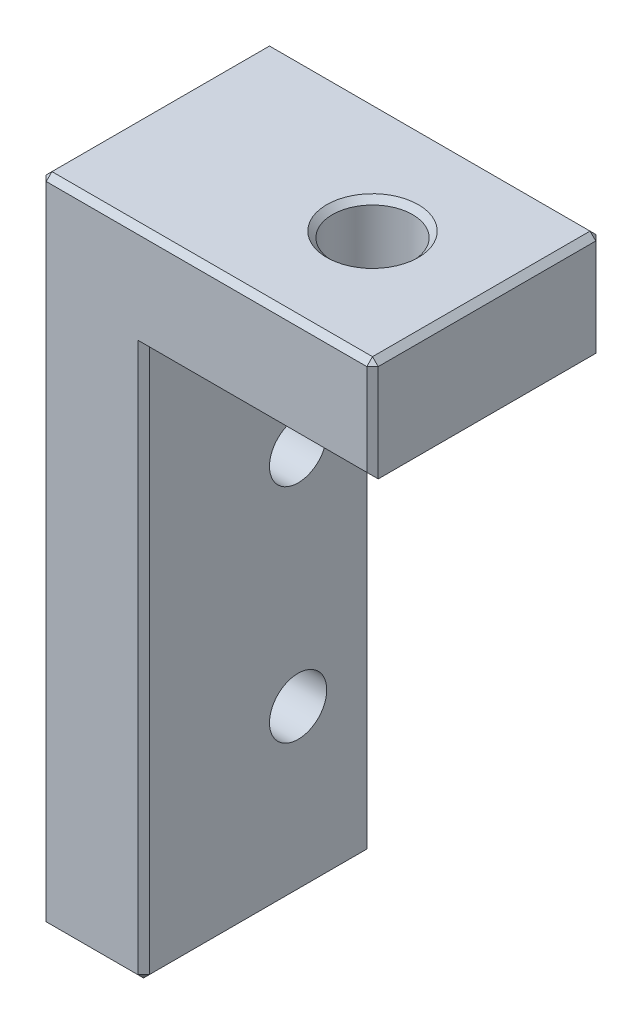
ISO-10303-21;
HEADER;
FILE_DESCRIPTION(('STEP AP214'),'2;1');
FILE_NAME('part.step','',(''),(''),'','','');
FILE_SCHEMA(('AUTOMOTIVE_DESIGN { 1 0 10303 214 1 1 1 1 }'));
ENDSEC;
DATA;
#1=APPLICATION_CONTEXT('core data for automotive mechanical design processes');
#2=APPLICATION_PROTOCOL_DEFINITION('international standard','automotive_design',2000,#1);
#3=PRODUCT_CONTEXT('',#1,'mechanical');
#4=PRODUCT('Part','Part','',(#3));
#5=PRODUCT_RELATED_PRODUCT_CATEGORY('part','',(#4));
#6=PRODUCT_DEFINITION_FORMATION('','',#4);
#7=PRODUCT_DEFINITION_CONTEXT('part definition',#1,'design');
#8=PRODUCT_DEFINITION('design','',#6,#7);
#9=PRODUCT_DEFINITION_SHAPE('','',#8);
#10=(LENGTH_UNIT() NAMED_UNIT(*) SI_UNIT(.MILLI.,.METRE.));
#11=(NAMED_UNIT(*) PLANE_ANGLE_UNIT() SI_UNIT($,.RADIAN.));
#12=(NAMED_UNIT(*) SI_UNIT($,.STERADIAN.) SOLID_ANGLE_UNIT());
#13=UNCERTAINTY_MEASURE_WITH_UNIT(LENGTH_MEASURE(1.E-05),#10,'distance_accuracy_value','');
#14=(GEOMETRIC_REPRESENTATION_CONTEXT(3) GLOBAL_UNCERTAINTY_ASSIGNED_CONTEXT((#13)) GLOBAL_UNIT_ASSIGNED_CONTEXT((#10,
#11,#12)) REPRESENTATION_CONTEXT('',''));
#15=CARTESIAN_POINT('',(0.,0.,0.));
#16=DIRECTION('',(0.,0.,1.));
#17=DIRECTION('',(1.,0.,0.));
#18=AXIS2_PLACEMENT_3D('',#15,#16,#17);
#19=CARTESIAN_POINT('',(4.5,0.,10.));
#20=DIRECTION('',(0.,1.,0.));
#21=DIRECTION('',(0.,0.,1.));
#22=AXIS2_PLACEMENT_3D('',#19,#20,#21);
#23=PLANE('',#22);
#24=DIRECTION('',(0.,0.,1.));
#25=VECTOR('',#24,1.);
#26=CARTESIAN_POINT('',(4.25,0.,10.));
#27=LINE('',#26,#25);
#28=CARTESIAN_POINT('',(4.25,0.,0.250000000000004));
#29=VERTEX_POINT('',#28);
#30=CARTESIAN_POINT('',(4.25,0.,9.75));
#31=VERTEX_POINT('',#30);
#32=EDGE_CURVE('E219',#29,#31,#27,.T.);
#33=ORIENTED_EDGE('',*,*,#32,.T.);
#34=DIRECTION('',(-1.,0.,0.));
#35=VECTOR('',#34,1.);
#36=CARTESIAN_POINT('',(4.5,0.,9.75));
#37=LINE('',#36,#35);
#38=CARTESIAN_POINT('',(0.250000000000004,0.,9.75));
#39=VERTEX_POINT('',#38);
#40=EDGE_CURVE('E226',#31,#39,#37,.T.);
#41=ORIENTED_EDGE('',*,*,#40,.T.);
#42=DIRECTION('',(0.,0.,-1.));
#43=VECTOR('',#42,1.);
#44=CARTESIAN_POINT('',(0.250000000000004,0.,10.));
#45=LINE('',#44,#43);
#46=CARTESIAN_POINT('',(0.250000000000004,0.,0.250000000000004));
#47=VERTEX_POINT('',#46);
#48=EDGE_CURVE('E222',#39,#47,#45,.T.);
#49=ORIENTED_EDGE('',*,*,#48,.T.);
#50=DIRECTION('',(1.,0.,0.));
#51=VECTOR('',#50,1.);
#52=CARTESIAN_POINT('',(4.5,0.,0.250000000000004));
#53=LINE('',#52,#51);
#54=EDGE_CURVE('E216',#47,#29,#53,.T.);
#55=ORIENTED_EDGE('',*,*,#54,.T.);
#56=EDGE_LOOP('',(#33,#41,#49,#55));
#57=FACE_BOUND('',#56,.T.);
#58=ADVANCED_FACE('F40',(#57),#23,.F.);
#59=CARTESIAN_POINT('',(4.5,24.,10.));
#60=DIRECTION('',(-1.,0.,0.));
#61=DIRECTION('',(0.,-1.,0.));
#62=AXIS2_PLACEMENT_3D('',#59,#60,#61);
#63=PLANE('',#62);
#64=CARTESIAN_POINT('',(4.5,7.15,3.25));
#65=DIRECTION('',(1.,0.,0.));
#66=DIRECTION('',(0.,1.,0.));
#67=AXIS2_PLACEMENT_3D('',#64,#65,#66);
#68=CIRCLE('',#67,1.25);
#69=CARTESIAN_POINT('',(4.5,8.4,3.25));
#70=VERTEX_POINT('',#69);
#71=EDGE_CURVE('E409',#70,#70,#68,.T.);
#72=ORIENTED_EDGE('',*,*,#71,.F.);
#73=EDGE_LOOP('',(#72));
#74=FACE_BOUND('',#73,.T.);
#75=CARTESIAN_POINT('',(4.5,16.85,3.25));
#76=DIRECTION('',(1.,0.,0.));
#77=DIRECTION('',(0.,-1.,0.));
#78=AXIS2_PLACEMENT_3D('',#75,#76,#77);
#79=CIRCLE('',#78,1.25);
#80=CARTESIAN_POINT('',(4.5,15.6,3.25));
#81=VERTEX_POINT('',#80);
#82=EDGE_CURVE('E406',#81,#81,#79,.T.);
#83=ORIENTED_EDGE('',*,*,#82,.F.);
#84=EDGE_LOOP('',(#83));
#85=FACE_BOUND('',#84,.T.);
#86=DIRECTION('',(0.,0.,-1.));
#87=VECTOR('',#86,1.);
#88=CARTESIAN_POINT('',(4.5,24.,10.));
#89=LINE('',#88,#87);
#90=CARTESIAN_POINT('',(4.5,24.,9.75));
#91=VERTEX_POINT('',#90);
#92=CARTESIAN_POINT('',(4.5,24.,0.250000000000004));
#93=VERTEX_POINT('',#92);
#94=EDGE_CURVE('E170',#91,#93,#89,.T.);
#95=ORIENTED_EDGE('',*,*,#94,.F.);
#96=DIRECTION('',(0.,-1.,0.));
#97=VECTOR('',#96,1.);
#98=CARTESIAN_POINT('',(4.5,24.,9.75));
#99=LINE('',#98,#97);
#100=CARTESIAN_POINT('',(4.5,0.250000000000004,9.75));
#101=VERTEX_POINT('',#100);
#102=EDGE_CURVE('E257',#91,#101,#99,.T.);
#103=ORIENTED_EDGE('',*,*,#102,.T.);
#104=DIRECTION('',(0.,0.,-1.));
#105=VECTOR('',#104,1.);
#106=CARTESIAN_POINT('',(4.5,0.250000000000004,10.));
#107=LINE('',#106,#105);
#108=CARTESIAN_POINT('',(4.5,0.250000000000004,0.250000000000004));
#109=VERTEX_POINT('',#108);
#110=EDGE_CURVE('E253',#101,#109,#107,.T.);
#111=ORIENTED_EDGE('',*,*,#110,.T.);
#112=DIRECTION('',(0.,1.,0.));
#113=VECTOR('',#112,1.);
#114=CARTESIAN_POINT('',(4.5,24.,0.250000000000004));
#115=LINE('',#114,#113);
#116=EDGE_CURVE('E250',#109,#93,#115,.T.);
#117=ORIENTED_EDGE('',*,*,#116,.T.);
#118=EDGE_LOOP('',(#95,#103,#111,#117));
#119=FACE_BOUND('',#118,.T.);
#120=ADVANCED_FACE('F466',(#74,#85,#119),#63,.F.);
#121=CARTESIAN_POINT('',(14.5,24.,10.));
#122=DIRECTION('',(0.,1.,0.));
#123=DIRECTION('',(-1.,0.,0.));
#124=AXIS2_PLACEMENT_3D('',#121,#122,#123);
#125=PLANE('',#124);
#126=CARTESIAN_POINT('',(9.49999999999998,24.,5.));
#127=DIRECTION('',(0.,1.,0.));
#128=DIRECTION('',(-1.,0.,0.));
#129=AXIS2_PLACEMENT_3D('',#126,#127,#128);
#130=CIRCLE('',#129,2.);
#131=CARTESIAN_POINT('',(7.49999999999998,24.,5.));
#132=VERTEX_POINT('',#131);
#133=EDGE_CURVE('E279',#132,#132,#130,.T.);
#134=ORIENTED_EDGE('',*,*,#133,.T.);
#135=EDGE_LOOP('',(#134));
#136=FACE_BOUND('',#135,.T.);
#137=DIRECTION('',(0.,0.,-1.));
#138=VECTOR('',#137,1.);
#139=CARTESIAN_POINT('',(14.5,24.,10.));
#140=LINE('',#139,#138);
#141=CARTESIAN_POINT('',(14.5,24.,9.75));
#142=VERTEX_POINT('',#141);
#143=CARTESIAN_POINT('',(14.5,24.,0.250000000000004));
#144=VERTEX_POINT('',#143);
#145=EDGE_CURVE('E415',#142,#144,#140,.T.);
#146=ORIENTED_EDGE('',*,*,#145,.F.);
#147=DIRECTION('',(-1.,0.,0.));
#148=VECTOR('',#147,1.);
#149=CARTESIAN_POINT('',(14.5,24.,9.75));
#150=LINE('',#149,#148);
#151=EDGE_CURVE('E286',#142,#91,#150,.T.);
#152=ORIENTED_EDGE('',*,*,#151,.T.);
#153=ORIENTED_EDGE('',*,*,#94,.T.);
#154=DIRECTION('',(1.,0.,0.));
#155=VECTOR('',#154,1.);
#156=CARTESIAN_POINT('',(14.5,24.,0.250000000000004));
#157=LINE('',#156,#155);
#158=EDGE_CURVE('E283',#93,#144,#157,.T.);
#159=ORIENTED_EDGE('',*,*,#158,.T.);
#160=EDGE_LOOP('',(#146,#152,#153,#159));
#161=FACE_BOUND('',#160,.T.);
#162=ADVANCED_FACE('F472',(#136,#161),#125,.F.);
#163=CARTESIAN_POINT('',(14.5,28.5,10.));
#164=DIRECTION('',(-1.,0.,0.));
#165=DIRECTION('',(0.,-1.,0.));
#166=AXIS2_PLACEMENT_3D('',#163,#164,#165);
#167=PLANE('',#166);
#168=DIRECTION('',(0.,0.,1.));
#169=VECTOR('',#168,1.);
#170=CARTESIAN_POINT('',(14.5,28.25,10.));
#171=LINE('',#170,#169);
#172=CARTESIAN_POINT('',(14.5,28.25,0.250000000000004));
#173=VERTEX_POINT('',#172);
#174=CARTESIAN_POINT('',(14.5,28.25,9.75));
#175=VERTEX_POINT('',#174);
#176=EDGE_CURVE('E191',#173,#175,#171,.T.);
#177=ORIENTED_EDGE('',*,*,#176,.T.);
#178=DIRECTION('',(0.,-1.,0.));
#179=VECTOR('',#178,1.);
#180=CARTESIAN_POINT('',(14.5,28.5,9.75));
#181=LINE('',#180,#179);
#182=EDGE_CURVE('E294',#175,#142,#181,.T.);
#183=ORIENTED_EDGE('',*,*,#182,.T.);
#184=ORIENTED_EDGE('',*,*,#145,.T.);
#185=DIRECTION('',(0.,1.,0.));
#186=VECTOR('',#185,1.);
#187=CARTESIAN_POINT('',(14.5,28.5,0.250000000000004));
#188=LINE('',#187,#186);
#189=EDGE_CURVE('E289',#144,#173,#188,.T.);
#190=ORIENTED_EDGE('',*,*,#189,.T.);
#191=EDGE_LOOP('',(#177,#183,#184,#190));
#192=FACE_BOUND('',#191,.T.);
#193=ADVANCED_FACE('F655',(#192),#167,.F.);
#194=CARTESIAN_POINT('',(0.,28.5,10.));
#195=DIRECTION('',(0.,-1.,0.));
#196=DIRECTION('',(0.,0.,-1.));
#197=AXIS2_PLACEMENT_3D('',#194,#195,#196);
#198=PLANE('',#197);
#199=CARTESIAN_POINT('',(9.49999999999997,28.5,5.));
#200=DIRECTION('',(0.,-1.,0.));
#201=DIRECTION('',(0.,0.,-1.));
#202=AXIS2_PLACEMENT_3D('',#199,#200,#201);
#203=CIRCLE('',#202,1.99999999999999);
#204=CARTESIAN_POINT('',(9.49999999999997,28.5,3.00000000000001));
#205=VERTEX_POINT('',#204);
#206=EDGE_CURVE('E199',#205,#205,#203,.T.);
#207=ORIENTED_EDGE('',*,*,#206,.T.);
#208=EDGE_LOOP('',(#207));
#209=FACE_BOUND('',#208,.T.);
#210=DIRECTION('',(1.,0.,0.));
#211=VECTOR('',#210,1.);
#212=CARTESIAN_POINT('',(0.,28.5,9.75));
#213=LINE('',#212,#211);
#214=CARTESIAN_POINT('',(0.250000000000002,28.5,9.75));
#215=VERTEX_POINT('',#214);
#216=CARTESIAN_POINT('',(14.25,28.5,9.75));
#217=VERTEX_POINT('',#216);
#218=EDGE_CURVE('E197',#215,#217,#213,.T.);
#219=ORIENTED_EDGE('',*,*,#218,.T.);
#220=DIRECTION('',(0.,0.,-1.));
#221=VECTOR('',#220,1.);
#222=CARTESIAN_POINT('',(14.25,28.5,10.));
#223=LINE('',#222,#221);
#224=CARTESIAN_POINT('',(14.25,28.5,0.250000000000004));
#225=VERTEX_POINT('',#224);
#226=EDGE_CURVE('E189',#217,#225,#223,.T.);
#227=ORIENTED_EDGE('',*,*,#226,.T.);
#228=DIRECTION('',(-1.,0.,0.));
#229=VECTOR('',#228,1.);
#230=CARTESIAN_POINT('',(0.,28.5,0.250000000000004));
#231=LINE('',#230,#229);
#232=CARTESIAN_POINT('',(0.250000000000002,28.5,0.250000000000004));
#233=VERTEX_POINT('',#232);
#234=EDGE_CURVE('E157',#225,#233,#231,.T.);
#235=ORIENTED_EDGE('',*,*,#234,.T.);
#236=DIRECTION('',(0.,0.,1.));
#237=VECTOR('',#236,1.);
#238=CARTESIAN_POINT('',(0.250000000000002,28.5,10.));
#239=LINE('',#238,#237);
#240=EDGE_CURVE('E169',#233,#215,#239,.T.);
#241=ORIENTED_EDGE('',*,*,#240,.T.);
#242=EDGE_LOOP('',(#219,#227,#235,#241));
#243=FACE_BOUND('',#242,.T.);
#244=ADVANCED_FACE('F195',(#209,#243),#198,.F.);
#245=CARTESIAN_POINT('',(0.,0.,10.));
#246=DIRECTION('',(1.,0.,0.));
#247=DIRECTION('',(0.,1.,0.));
#248=AXIS2_PLACEMENT_3D('',#245,#246,#247);
#249=PLANE('',#248);
#250=DIRECTION('',(0.,-1.,0.));
#251=VECTOR('',#250,1.);
#252=CARTESIAN_POINT('',(0.,0.,0.250000000000004));
#253=LINE('',#252,#251);
#254=CARTESIAN_POINT('',(0.,28.25,0.250000000000004));
#255=VERTEX_POINT('',#254);
#256=CARTESIAN_POINT('',(0.,0.250000000000004,0.250000000000004));
#257=VERTEX_POINT('',#256);
#258=EDGE_CURVE('E237',#255,#257,#253,.T.);
#259=ORIENTED_EDGE('',*,*,#258,.T.);
#260=DIRECTION('',(0.,0.,1.));
#261=VECTOR('',#260,1.);
#262=CARTESIAN_POINT('',(0.,0.250000000000004,10.));
#263=LINE('',#262,#261);
#264=CARTESIAN_POINT('',(0.,0.250000000000004,9.75));
#265=VERTEX_POINT('',#264);
#266=EDGE_CURVE('E246',#257,#265,#263,.T.);
#267=ORIENTED_EDGE('',*,*,#266,.T.);
#268=DIRECTION('',(0.,1.,0.));
#269=VECTOR('',#268,1.);
#270=CARTESIAN_POINT('',(0.,0.,9.75));
#271=LINE('',#270,#269);
#272=CARTESIAN_POINT('',(0.,28.25,9.75));
#273=VERTEX_POINT('',#272);
#274=EDGE_CURVE('E243',#265,#273,#271,.T.);
#275=ORIENTED_EDGE('',*,*,#274,.T.);
#276=DIRECTION('',(0.,0.,-1.));
#277=VECTOR('',#276,1.);
#278=CARTESIAN_POINT('',(0.,28.25,10.));
#279=LINE('',#278,#277);
#280=EDGE_CURVE('E240',#273,#255,#279,.T.);
#281=ORIENTED_EDGE('',*,*,#280,.T.);
#282=EDGE_LOOP('',(#259,#267,#275,#281));
#283=FACE_BOUND('',#282,.T.);
#284=CARTESIAN_POINT('',(0.,7.15,3.25));
#285=DIRECTION('',(1.,0.,0.));
#286=DIRECTION('',(0.,1.,0.));
#287=AXIS2_PLACEMENT_3D('',#284,#285,#286);
#288=CIRCLE('',#287,1.5);
#289=CARTESIAN_POINT('',(0.,8.65,3.25));
#290=VERTEX_POINT('',#289);
#291=EDGE_CURVE('E233',#290,#290,#288,.T.);
#292=ORIENTED_EDGE('',*,*,#291,.T.);
#293=EDGE_LOOP('',(#292));
#294=FACE_BOUND('',#293,.T.);
#295=CARTESIAN_POINT('',(0.,16.85,3.25));
#296=DIRECTION('',(1.,0.,0.));
#297=DIRECTION('',(0.,1.,0.));
#298=AXIS2_PLACEMENT_3D('',#295,#296,#297);
#299=CIRCLE('',#298,1.5);
#300=CARTESIAN_POINT('',(0.,18.35,3.25));
#301=VERTEX_POINT('',#300);
#302=EDGE_CURVE('E229',#301,#301,#299,.T.);
#303=ORIENTED_EDGE('',*,*,#302,.T.);
#304=EDGE_LOOP('',(#303));
#305=FACE_BOUND('',#304,.T.);
#306=ADVANCED_FACE('F642',(#283,#294,#305),#249,.F.);
#307=CARTESIAN_POINT('',(0.,0.,10.));
#308=DIRECTION('',(0.,0.,-1.));
#309=DIRECTION('',(-1.,0.,0.));
#310=AXIS2_PLACEMENT_3D('',#307,#308,#309);
#311=PLANE('',#310);
#312=DIRECTION('',(-1.,0.,0.));
#313=VECTOR('',#312,1.);
#314=CARTESIAN_POINT('',(0.,28.25,10.));
#315=LINE('',#314,#313);
#316=CARTESIAN_POINT('',(14.25,28.25,10.));
#317=VERTEX_POINT('',#316);
#318=CARTESIAN_POINT('',(0.250000000000002,28.25,10.));
#319=VERTEX_POINT('',#318);
#320=EDGE_CURVE('E260',#317,#319,#315,.T.);
#321=ORIENTED_EDGE('',*,*,#320,.T.);
#322=DIRECTION('',(0.,-1.,0.));
#323=VECTOR('',#322,1.);
#324=CARTESIAN_POINT('',(0.250000000000004,0.,10.));
#325=LINE('',#324,#323);
#326=CARTESIAN_POINT('',(0.250000000000004,0.250000000000004,10.));
#327=VERTEX_POINT('',#326);
#328=EDGE_CURVE('E275',#319,#327,#325,.T.);
#329=ORIENTED_EDGE('',*,*,#328,.T.);
#330=DIRECTION('',(1.,0.,0.));
#331=VECTOR('',#330,1.);
#332=CARTESIAN_POINT('',(0.,0.250000000000004,10.));
#333=LINE('',#332,#331);
#334=CARTESIAN_POINT('',(4.25,0.250000000000004,10.));
#335=VERTEX_POINT('',#334);
#336=EDGE_CURVE('E272',#327,#335,#333,.T.);
#337=ORIENTED_EDGE('',*,*,#336,.T.);
#338=DIRECTION('',(0.,1.,0.));
#339=VECTOR('',#338,1.);
#340=CARTESIAN_POINT('',(4.25,0.,10.));
#341=LINE('',#340,#339);
#342=CARTESIAN_POINT('',(4.24999999999999,24.25,10.));
#343=VERTEX_POINT('',#342);
#344=EDGE_CURVE('E269',#335,#343,#341,.T.);
#345=ORIENTED_EDGE('',*,*,#344,.T.);
#346=DIRECTION('',(1.,0.,0.));
#347=VECTOR('',#346,1.);
#348=CARTESIAN_POINT('',(0.,24.25,10.));
#349=LINE('',#348,#347);
#350=CARTESIAN_POINT('',(14.25,24.25,10.));
#351=VERTEX_POINT('',#350);
#352=EDGE_CURVE('E266',#343,#351,#349,.T.);
#353=ORIENTED_EDGE('',*,*,#352,.T.);
#354=DIRECTION('',(0.,1.,0.));
#355=VECTOR('',#354,1.);
#356=CARTESIAN_POINT('',(14.25,0.,10.));
#357=LINE('',#356,#355);
#358=EDGE_CURVE('E263',#351,#317,#357,.T.);
#359=ORIENTED_EDGE('',*,*,#358,.T.);
#360=EDGE_LOOP('',(#321,#329,#337,#345,#353,#359));
#361=FACE_BOUND('',#360,.T.);
#362=ADVANCED_FACE('F443',(#361),#311,.F.);
#363=CARTESIAN_POINT('',(0.,0.,0.));
#364=DIRECTION('',(0.,0.,-1.));
#365=DIRECTION('',(-1.,0.,0.));
#366=AXIS2_PLACEMENT_3D('',#363,#364,#365);
#367=PLANE('',#366);
#368=DIRECTION('',(-1.,0.,0.));
#369=VECTOR('',#368,1.);
#370=CARTESIAN_POINT('',(4.5,24.25,0.));
#371=LINE('',#370,#369);
#372=CARTESIAN_POINT('',(14.25,24.25,0.));
#373=VERTEX_POINT('',#372);
#374=CARTESIAN_POINT('',(4.24999999999999,24.25,0.));
#375=VERTEX_POINT('',#374);
#376=EDGE_CURVE('E59',#373,#375,#371,.T.);
#377=ORIENTED_EDGE('',*,*,#376,.T.);
#378=DIRECTION('',(0.,-1.,0.));
#379=VECTOR('',#378,1.);
#380=CARTESIAN_POINT('',(4.25,0.,0.));
#381=LINE('',#380,#379);
#382=CARTESIAN_POINT('',(4.25,0.250000000000004,0.));
#383=VERTEX_POINT('',#382);
#384=EDGE_CURVE('E310',#375,#383,#381,.T.);
#385=ORIENTED_EDGE('',*,*,#384,.T.);
#386=DIRECTION('',(-1.,0.,0.));
#387=VECTOR('',#386,1.);
#388=CARTESIAN_POINT('',(0.,0.250000000000004,0.));
#389=LINE('',#388,#387);
#390=CARTESIAN_POINT('',(0.250000000000004,0.250000000000004,0.));
#391=VERTEX_POINT('',#390);
#392=EDGE_CURVE('E297',#383,#391,#389,.T.);
#393=ORIENTED_EDGE('',*,*,#392,.T.);
#394=DIRECTION('',(0.,1.,0.));
#395=VECTOR('',#394,1.);
#396=CARTESIAN_POINT('',(0.250000000000001,28.5,0.));
#397=LINE('',#396,#395);
#398=CARTESIAN_POINT('',(0.250000000000001,28.25,0.));
#399=VERTEX_POINT('',#398);
#400=EDGE_CURVE('E300',#391,#399,#397,.T.);
#401=ORIENTED_EDGE('',*,*,#400,.T.);
#402=DIRECTION('',(1.,0.,0.));
#403=VECTOR('',#402,1.);
#404=CARTESIAN_POINT('',(14.5,28.25,0.));
#405=LINE('',#404,#403);
#406=CARTESIAN_POINT('',(14.25,28.25,0.));
#407=VERTEX_POINT('',#406);
#408=EDGE_CURVE('E303',#399,#407,#405,.T.);
#409=ORIENTED_EDGE('',*,*,#408,.T.);
#410=DIRECTION('',(0.,-1.,0.));
#411=VECTOR('',#410,1.);
#412=CARTESIAN_POINT('',(14.25,24.,0.));
#413=LINE('',#412,#411);
#414=EDGE_CURVE('E64',#407,#373,#413,.T.);
#415=ORIENTED_EDGE('',*,*,#414,.T.);
#416=EDGE_LOOP('',(#377,#385,#393,#401,#409,#415));
#417=FACE_BOUND('',#416,.T.);
#418=ADVANCED_FACE('F653',(#417),#367,.T.);
#419=CARTESIAN_POINT('',(9.49999999999996,34.,5.));
#420=DIRECTION('',(0.,-1.,0.));
#421=DIRECTION('',(1.,0.,0.));
#422=AXIS2_PLACEMENT_3D('',#419,#420,#421);
#423=CYLINDRICAL_SURFACE('',#422,1.75);
#424=CARTESIAN_POINT('',(9.49999999999997,28.25,5.));
#425=DIRECTION('',(0.,-1.,0.));
#426=DIRECTION('',(0.,0.,-1.));
#427=AXIS2_PLACEMENT_3D('',#424,#425,#426);
#428=CIRCLE('',#427,1.75);
#429=CARTESIAN_POINT('',(9.49999999999997,28.25,3.25));
#430=VERTEX_POINT('',#429);
#431=EDGE_CURVE('E212',#430,#430,#428,.F.);
#432=ORIENTED_EDGE('',*,*,#431,.T.);
#433=EDGE_LOOP('',(#432));
#434=FACE_BOUND('',#433,.T.);
#435=CARTESIAN_POINT('',(9.49999999999998,24.25,5.));
#436=DIRECTION('',(0.,1.,0.));
#437=DIRECTION('',(0.,0.,1.));
#438=AXIS2_PLACEMENT_3D('',#435,#436,#437);
#439=CIRCLE('',#438,1.75);
#440=CARTESIAN_POINT('',(9.49999999999998,24.25,6.75));
#441=VERTEX_POINT('',#440);
#442=EDGE_CURVE('E204',#441,#441,#439,.F.);
#443=ORIENTED_EDGE('',*,*,#442,.T.);
#444=EDGE_LOOP('',(#443));
#445=FACE_BOUND('',#444,.T.);
#446=ADVANCED_FACE('F866',(#434,#445),#423,.F.);
#447=CARTESIAN_POINT('',(-5.5,16.85,3.25));
#448=DIRECTION('',(1.,0.,0.));
#449=DIRECTION('',(0.,1.,0.));
#450=AXIS2_PLACEMENT_3D('',#447,#448,#449);
#451=CYLINDRICAL_SURFACE('',#450,1.25);
#452=CARTESIAN_POINT('',(0.249999999999995,16.85,3.25));
#453=DIRECTION('',(1.,0.,0.));
#454=DIRECTION('',(0.,0.,-1.));
#455=AXIS2_PLACEMENT_3D('',#452,#453,#454);
#456=CIRCLE('',#455,1.25);
#457=CARTESIAN_POINT('',(0.249999999999995,16.85,2.));
#458=VERTEX_POINT('',#457);
#459=EDGE_CURVE('E11',#458,#458,#456,.F.);
#460=ORIENTED_EDGE('',*,*,#459,.T.);
#461=EDGE_LOOP('',(#460));
#462=FACE_BOUND('',#461,.T.);
#463=ORIENTED_EDGE('',*,*,#82,.T.);
#464=EDGE_LOOP('',(#463));
#465=FACE_BOUND('',#464,.T.);
#466=ADVANCED_FACE('F857',(#462,#465),#451,.F.);
#467=CARTESIAN_POINT('',(-5.5,7.15,3.25));
#468=DIRECTION('',(1.,0.,0.));
#469=DIRECTION('',(0.,1.,0.));
#470=AXIS2_PLACEMENT_3D('',#467,#468,#469);
#471=CYLINDRICAL_SURFACE('',#470,1.25);
#472=CARTESIAN_POINT('',(0.249999999999998,7.15,3.25));
#473=DIRECTION('',(1.,0.,0.));
#474=DIRECTION('',(0.,0.,-1.));
#475=AXIS2_PLACEMENT_3D('',#472,#473,#474);
#476=CIRCLE('',#475,1.25);
#477=CARTESIAN_POINT('',(0.249999999999998,7.15,2.));
#478=VERTEX_POINT('',#477);
#479=EDGE_CURVE('E51',#478,#478,#476,.F.);
#480=ORIENTED_EDGE('',*,*,#479,.T.);
#481=EDGE_LOOP('',(#480));
#482=FACE_BOUND('',#481,.T.);
#483=ORIENTED_EDGE('',*,*,#71,.T.);
#484=EDGE_LOOP('',(#483));
#485=FACE_BOUND('',#484,.T.);
#486=ADVANCED_FACE('F484',(#482,#485),#471,.F.);
#487=CARTESIAN_POINT('',(9.49999999999997,28.5,5.));
#488=DIRECTION('',(0.,1.,0.));
#489=DIRECTION('',(0.,0.,1.));
#490=AXIS2_PLACEMENT_3D('',#487,#488,#489);
#491=CONICAL_SURFACE('',#490,1.99999999999999,0.785398163397441);
#492=ORIENTED_EDGE('',*,*,#431,.F.);
#493=EDGE_LOOP('',(#492));
#494=FACE_BOUND('',#493,.T.);
#495=ORIENTED_EDGE('',*,*,#206,.F.);
#496=EDGE_LOOP('',(#495));
#497=FACE_BOUND('',#496,.T.);
#498=ADVANCED_FACE('F478',(#494,#497),#491,.F.);
#499=CARTESIAN_POINT('',(14.25,0.,10.));
#500=DIRECTION('',(-0.707106781186548,0.,-0.707106781186547));
#501=DIRECTION('',(0.,1.,0.));
#502=AXIS2_PLACEMENT_3D('',#499,#500,#501);
#503=PLANE('',#502);
#504=DIRECTION('',(0.577350269189624,-0.577350269189628,-0.577350269189625));
#505=VECTOR('',#504,1.);
#506=CARTESIAN_POINT('',(22.3333333333333,16.1666666666666,1.91666666666664));
#507=LINE('',#506,#505);
#508=EDGE_CURVE('E396',#142,#351,#507,.F.);
#509=ORIENTED_EDGE('',*,*,#508,.F.);
#510=ORIENTED_EDGE('',*,*,#182,.F.);
#511=DIRECTION('',(-0.707106781186547,0.,0.707106781186548));
#512=VECTOR('',#511,1.);
#513=CARTESIAN_POINT('',(14.25,28.25,10.));
#514=LINE('',#513,#512);
#515=EDGE_CURVE('E399',#317,#175,#514,.F.);
#516=ORIENTED_EDGE('',*,*,#515,.F.);
#517=ORIENTED_EDGE('',*,*,#358,.F.);
#518=EDGE_LOOP('',(#509,#510,#516,#517));
#519=FACE_BOUND('',#518,.T.);
#520=ADVANCED_FACE('F450',(#519),#503,.F.);
#521=CARTESIAN_POINT('',(14.5,28.5,0.250000000000004));
#522=DIRECTION('',(0.707106781186548,0.,-0.707106781186547));
#523=DIRECTION('',(0.,-1.,0.));
#524=AXIS2_PLACEMENT_3D('',#521,#522,#523);
#525=PLANE('',#524);
#526=DIRECTION('',(-0.707106781186547,0.,-0.707106781186548));
#527=VECTOR('',#526,1.);
#528=CARTESIAN_POINT('',(14.375,28.25,0.125000000000002));
#529=LINE('',#528,#527);
#530=EDGE_CURVE('E179',#173,#407,#529,.T.);
#531=ORIENTED_EDGE('',*,*,#530,.F.);
#532=ORIENTED_EDGE('',*,*,#189,.F.);
#533=DIRECTION('',(-0.577350269189624,0.577350269189628,-0.577350269189625));
#534=VECTOR('',#533,1.);
#535=CARTESIAN_POINT('',(13.,25.5,-1.25));
#536=LINE('',#535,#534);
#537=EDGE_CURVE('E392',#373,#144,#536,.F.);
#538=ORIENTED_EDGE('',*,*,#537,.F.);
#539=ORIENTED_EDGE('',*,*,#414,.F.);
#540=EDGE_LOOP('',(#531,#532,#538,#539));
#541=FACE_BOUND('',#540,.T.);
#542=ADVANCED_FACE('F462',(#541),#525,.T.);
#543=CARTESIAN_POINT('',(14.25,28.5,10.));
#544=DIRECTION('',(-0.707106781186547,-0.707106781186547,0.));
#545=DIRECTION('',(0.,0.,-1.));
#546=AXIS2_PLACEMENT_3D('',#543,#544,#545);
#547=PLANE('',#546);
#548=DIRECTION('',(0.707106781186547,-0.707106781186547,0.));
#549=VECTOR('',#548,1.);
#550=CARTESIAN_POINT('',(14.375,28.375,9.75));
#551=LINE('',#550,#549);
#552=EDGE_CURVE('E45',#175,#217,#551,.F.);
#553=ORIENTED_EDGE('',*,*,#552,.F.);
#554=ORIENTED_EDGE('',*,*,#176,.F.);
#555=DIRECTION('',(-0.707106781186547,0.707106781186547,0.));
#556=VECTOR('',#555,1.);
#557=CARTESIAN_POINT('',(14.25,28.5,0.250000000000004));
#558=LINE('',#557,#556);
#559=EDGE_CURVE('E177',#225,#173,#558,.F.);
#560=ORIENTED_EDGE('',*,*,#559,.F.);
#561=ORIENTED_EDGE('',*,*,#226,.F.);
#562=EDGE_LOOP('',(#553,#554,#560,#561));
#563=FACE_BOUND('',#562,.T.);
#564=ADVANCED_FACE('F188',(#563),#547,.F.);
#565=CARTESIAN_POINT('',(14.25,28.25,10.));
#566=DIRECTION('',(0.577350269189626,0.577350269189626,0.577350269189626));
#567=DIRECTION('',(0.707106781186547,0.,-0.707106781186547));
#568=AXIS2_PLACEMENT_3D('',#565,#566,#567);
#569=PLANE('',#568);
#570=ORIENTED_EDGE('',*,*,#515,.T.);
#571=ORIENTED_EDGE('',*,*,#552,.T.);
#572=DIRECTION('',(0.,0.707106781186547,-0.707106781186547));
#573=VECTOR('',#572,1.);
#574=CARTESIAN_POINT('',(14.25,28.25,10.));
#575=LINE('',#574,#573);
#576=EDGE_CURVE('E193',#317,#217,#575,.T.);
#577=ORIENTED_EDGE('',*,*,#576,.F.);
#578=EDGE_LOOP('',(#570,#571,#577));
#579=FACE_BOUND('',#578,.T.);
#580=ADVANCED_FACE('F451',(#579),#569,.T.);
#581=CARTESIAN_POINT('',(0.,24.25,10.));
#582=DIRECTION('',(0.,0.707106781186546,-0.707106781186549));
#583=DIRECTION('',(1.,0.,0.));
#584=AXIS2_PLACEMENT_3D('',#581,#582,#583);
#585=PLANE('',#584);
#586=ORIENTED_EDGE('',*,*,#508,.T.);
#587=ORIENTED_EDGE('',*,*,#352,.F.);
#588=DIRECTION('',(0.577350269189625,-0.577350269189627,-0.577350269189625));
#589=VECTOR('',#588,1.);
#590=CARTESIAN_POINT('',(12.3333333333333,16.1666666666666,1.91666666666665));
#591=LINE('',#590,#589);
#592=EDGE_CURVE('E383',#91,#343,#591,.F.);
#593=ORIENTED_EDGE('',*,*,#592,.F.);
#594=ORIENTED_EDGE('',*,*,#151,.F.);
#595=EDGE_LOOP('',(#586,#587,#593,#594));
#596=FACE_BOUND('',#595,.T.);
#597=ADVANCED_FACE('F453',(#596),#585,.F.);
#598=CARTESIAN_POINT('',(14.5,24.,0.250000000000004));
#599=DIRECTION('',(0.,-0.707106781186546,-0.707106781186549));
#600=DIRECTION('',(-1.,0.,0.));
#601=AXIS2_PLACEMENT_3D('',#598,#599,#600);
#602=PLANE('',#601);
#603=ORIENTED_EDGE('',*,*,#537,.T.);
#604=ORIENTED_EDGE('',*,*,#158,.F.);
#605=DIRECTION('',(-0.577350269189625,0.577350269189627,-0.577350269189625));
#606=VECTOR('',#605,1.);
#607=CARTESIAN_POINT('',(4.5,24.,0.250000000000004));
#608=LINE('',#607,#606);
#609=EDGE_CURVE('E181',#375,#93,#608,.F.);
#610=ORIENTED_EDGE('',*,*,#609,.F.);
#611=ORIENTED_EDGE('',*,*,#376,.F.);
#612=EDGE_LOOP('',(#603,#604,#610,#611));
#613=FACE_BOUND('',#612,.T.);
#614=ADVANCED_FACE('F459',(#613),#602,.T.);
#615=CARTESIAN_POINT('',(14.25,28.5,0.250000000000004));
#616=DIRECTION('',(0.577350269189626,0.577350269189626,-0.577350269189626));
#617=DIRECTION('',(-0.707106781186547,0.,-0.707106781186547));
#618=AXIS2_PLACEMENT_3D('',#615,#616,#617);
#619=PLANE('',#618);
#620=ORIENTED_EDGE('',*,*,#559,.T.);
#621=ORIENTED_EDGE('',*,*,#530,.T.);
#622=DIRECTION('',(0.,0.707106781186547,0.707106781186547));
#623=VECTOR('',#622,1.);
#624=CARTESIAN_POINT('',(14.25,28.5,0.250000000000004));
#625=LINE('',#624,#623);
#626=EDGE_CURVE('E161',#225,#407,#625,.F.);
#627=ORIENTED_EDGE('',*,*,#626,.F.);
#628=EDGE_LOOP('',(#620,#621,#627));
#629=FACE_BOUND('',#628,.T.);
#630=ADVANCED_FACE('F176',(#629),#619,.T.);
#631=CARTESIAN_POINT('',(0.,28.25,10.));
#632=DIRECTION('',(0.,-0.707106781186547,-0.707106781186547));
#633=DIRECTION('',(-1.,0.,0.));
#634=AXIS2_PLACEMENT_3D('',#631,#632,#633);
#635=PLANE('',#634);
#636=ORIENTED_EDGE('',*,*,#576,.T.);
#637=ORIENTED_EDGE('',*,*,#218,.F.);
#638=DIRECTION('',(0.,-0.707106781186547,0.707106781186547));
#639=VECTOR('',#638,1.);
#640=CARTESIAN_POINT('',(0.250000000000002,28.375,9.875));
#641=LINE('',#640,#639);
#642=EDGE_CURVE('E373',#319,#215,#641,.F.);
#643=ORIENTED_EDGE('',*,*,#642,.F.);
#644=ORIENTED_EDGE('',*,*,#320,.F.);
#645=EDGE_LOOP('',(#636,#637,#643,#644));
#646=FACE_BOUND('',#645,.T.);
#647=ADVANCED_FACE('F429',(#646),#635,.F.);
#648=CARTESIAN_POINT('',(4.25,0.,10.));
#649=DIRECTION('',(-0.707106781186547,0.,-0.707106781186547));
#650=DIRECTION('',(0.,1.,0.));
#651=AXIS2_PLACEMENT_3D('',#648,#649,#650);
#652=PLANE('',#651);
#653=ORIENTED_EDGE('',*,*,#592,.T.);
#654=ORIENTED_EDGE('',*,*,#344,.F.);
#655=DIRECTION('',(0.707106781186547,0.,-0.707106781186547));
#656=VECTOR('',#655,1.);
#657=CARTESIAN_POINT('',(4.375,0.250000000000004,9.875));
#658=LINE('',#657,#656);
#659=EDGE_CURVE('E369',#101,#335,#658,.F.);
#660=ORIENTED_EDGE('',*,*,#659,.F.);
#661=ORIENTED_EDGE('',*,*,#102,.F.);
#662=EDGE_LOOP('',(#653,#654,#660,#661));
#663=FACE_BOUND('',#662,.T.);
#664=ADVANCED_FACE('F585',(#663),#652,.F.);
#665=CARTESIAN_POINT('',(4.5,0.250000000000004,10.));
#666=DIRECTION('',(-0.707106781186547,0.707106781186547,0.));
#667=DIRECTION('',(0.,0.,-1.));
#668=AXIS2_PLACEMENT_3D('',#665,#666,#667);
#669=PLANE('',#668);
#670=DIRECTION('',(0.707106781186548,0.707106781186548,0.));
#671=VECTOR('',#670,1.);
#672=CARTESIAN_POINT('',(4.5,0.250000000000004,0.250000000000004));
#673=LINE('',#672,#671);
#674=EDGE_CURVE('E361',#109,#29,#673,.F.);
#675=ORIENTED_EDGE('',*,*,#674,.F.);
#676=ORIENTED_EDGE('',*,*,#110,.F.);
#677=DIRECTION('',(-0.707106781186548,-0.707106781186548,0.));
#678=VECTOR('',#677,1.);
#679=CARTESIAN_POINT('',(4.25,0.,9.75));
#680=LINE('',#679,#678);
#681=EDGE_CURVE('E365',#31,#101,#680,.F.);
#682=ORIENTED_EDGE('',*,*,#681,.F.);
#683=ORIENTED_EDGE('',*,*,#32,.F.);
#684=EDGE_LOOP('',(#675,#676,#682,#683));
#685=FACE_BOUND('',#684,.T.);
#686=ADVANCED_FACE('F578',(#685),#669,.F.);
#687=CARTESIAN_POINT('',(4.5,24.,0.250000000000004));
#688=DIRECTION('',(0.707106781186547,0.,-0.707106781186547));
#689=DIRECTION('',(0.,-1.,0.));
#690=AXIS2_PLACEMENT_3D('',#687,#688,#689);
#691=PLANE('',#690);
#692=ORIENTED_EDGE('',*,*,#609,.T.);
#693=ORIENTED_EDGE('',*,*,#116,.F.);
#694=DIRECTION('',(0.707106781186547,0.,0.707106781186547));
#695=VECTOR('',#694,1.);
#696=CARTESIAN_POINT('',(4.5,0.250000000000004,0.250000000000004));
#697=LINE('',#696,#695);
#698=EDGE_CURVE('E358',#383,#109,#697,.T.);
#699=ORIENTED_EDGE('',*,*,#698,.F.);
#700=ORIENTED_EDGE('',*,*,#384,.F.);
#701=EDGE_LOOP('',(#692,#693,#699,#700));
#702=FACE_BOUND('',#701,.T.);
#703=ADVANCED_FACE('F572',(#702),#691,.T.);
#704=CARTESIAN_POINT('',(0.,28.5,0.250000000000004));
#705=DIRECTION('',(0.,0.707106781186547,-0.707106781186547));
#706=DIRECTION('',(1.,0.,0.));
#707=AXIS2_PLACEMENT_3D('',#704,#705,#706);
#708=PLANE('',#707);
#709=ORIENTED_EDGE('',*,*,#626,.T.);
#710=ORIENTED_EDGE('',*,*,#408,.F.);
#711=DIRECTION('',(0.,-0.707106781186548,-0.707106781186548));
#712=VECTOR('',#711,1.);
#713=CARTESIAN_POINT('',(0.250000000000002,28.375,0.125000000000002));
#714=LINE('',#713,#712);
#715=EDGE_CURVE('E163',#233,#399,#714,.T.);
#716=ORIENTED_EDGE('',*,*,#715,.F.);
#717=ORIENTED_EDGE('',*,*,#234,.F.);
#718=EDGE_LOOP('',(#709,#710,#716,#717));
#719=FACE_BOUND('',#718,.T.);
#720=ADVANCED_FACE('F159',(#719),#708,.T.);
#721=CARTESIAN_POINT('',(0.,28.25,10.));
#722=DIRECTION('',(0.707106781186547,-0.707106781186547,0.));
#723=DIRECTION('',(0.,0.,-1.));
#724=AXIS2_PLACEMENT_3D('',#721,#722,#723);
#725=PLANE('',#724);
#726=DIRECTION('',(0.707106781186547,0.707106781186547,0.));
#727=VECTOR('',#726,1.);
#728=CARTESIAN_POINT('',(0.,28.25,9.75));
#729=LINE('',#728,#727);
#730=EDGE_CURVE('E182',#215,#273,#729,.F.);
#731=ORIENTED_EDGE('',*,*,#730,.F.);
#732=ORIENTED_EDGE('',*,*,#240,.F.);
#733=DIRECTION('',(-0.707106781186547,-0.707106781186547,0.));
#734=VECTOR('',#733,1.);
#735=CARTESIAN_POINT('',(0.,28.25,0.250000000000004));
#736=LINE('',#735,#734);
#737=EDGE_CURVE('E353',#255,#233,#736,.F.);
#738=ORIENTED_EDGE('',*,*,#737,.F.);
#739=ORIENTED_EDGE('',*,*,#280,.F.);
#740=EDGE_LOOP('',(#731,#732,#738,#739));
#741=FACE_BOUND('',#740,.T.);
#742=ADVANCED_FACE('F433',(#741),#725,.F.);
#743=CARTESIAN_POINT('',(0.,28.25,9.75));
#744=DIRECTION('',(-0.577350269189626,0.577350269189626,0.577350269189626));
#745=DIRECTION('',(0.707106781186547,0.,0.707106781186547));
#746=AXIS2_PLACEMENT_3D('',#743,#744,#745);
#747=PLANE('',#746);
#748=ORIENTED_EDGE('',*,*,#642,.T.);
#749=ORIENTED_EDGE('',*,*,#730,.T.);
#750=DIRECTION('',(-0.707106781186548,0.,-0.707106781186548));
#751=VECTOR('',#750,1.);
#752=CARTESIAN_POINT('',(0.,28.25,9.75));
#753=LINE('',#752,#751);
#754=EDGE_CURVE('E349',#319,#273,#753,.T.);
#755=ORIENTED_EDGE('',*,*,#754,.F.);
#756=EDGE_LOOP('',(#748,#749,#755));
#757=FACE_BOUND('',#756,.T.);
#758=ADVANCED_FACE('F435',(#757),#747,.T.);
#759=CARTESIAN_POINT('',(4.25,0.,9.75));
#760=DIRECTION('',(0.577350269189626,-0.577350269189626,0.577350269189626));
#761=DIRECTION('',(0.,-0.707106781186548,-0.707106781186548));
#762=AXIS2_PLACEMENT_3D('',#759,#760,#761);
#763=PLANE('',#762);
#764=ORIENTED_EDGE('',*,*,#681,.T.);
#765=ORIENTED_EDGE('',*,*,#659,.T.);
#766=DIRECTION('',(0.,0.707106781186547,0.707106781186547));
#767=VECTOR('',#766,1.);
#768=CARTESIAN_POINT('',(4.25,0.,9.75));
#769=LINE('',#768,#767);
#770=EDGE_CURVE('E345',#31,#335,#769,.T.);
#771=ORIENTED_EDGE('',*,*,#770,.F.);
#772=EDGE_LOOP('',(#764,#765,#771));
#773=FACE_BOUND('',#772,.T.);
#774=ADVANCED_FACE('F549',(#773),#763,.T.);
#775=CARTESIAN_POINT('',(4.5,0.250000000000004,0.250000000000004));
#776=DIRECTION('',(0.577350269189626,-0.577350269189626,-0.577350269189626));
#777=DIRECTION('',(0.,0.707106781186548,-0.707106781186548));
#778=AXIS2_PLACEMENT_3D('',#775,#776,#777);
#779=PLANE('',#778);
#780=ORIENTED_EDGE('',*,*,#698,.T.);
#781=ORIENTED_EDGE('',*,*,#674,.T.);
#782=DIRECTION('',(0.,0.707106781186547,-0.707106781186547));
#783=VECTOR('',#782,1.);
#784=CARTESIAN_POINT('',(4.25,0.125000000000002,0.125000000000002));
#785=LINE('',#784,#783);
#786=EDGE_CURVE('E341',#383,#29,#785,.F.);
#787=ORIENTED_EDGE('',*,*,#786,.F.);
#788=EDGE_LOOP('',(#780,#781,#787));
#789=FACE_BOUND('',#788,.T.);
#790=ADVANCED_FACE('F542',(#789),#779,.T.);
#791=CARTESIAN_POINT('',(0.,28.25,0.250000000000004));
#792=DIRECTION('',(-0.577350269189626,0.577350269189626,-0.577350269189626));
#793=DIRECTION('',(-0.707106781186548,-0.707106781186548,0.));
#794=AXIS2_PLACEMENT_3D('',#791,#792,#793);
#795=PLANE('',#794);
#796=ORIENTED_EDGE('',*,*,#737,.T.);
#797=ORIENTED_EDGE('',*,*,#715,.T.);
#798=DIRECTION('',(-0.707106781186547,0.,0.707106781186547));
#799=VECTOR('',#798,1.);
#800=CARTESIAN_POINT('',(0.,28.25,0.250000000000004));
#801=LINE('',#800,#799);
#802=EDGE_CURVE('E337',#255,#399,#801,.F.);
#803=ORIENTED_EDGE('',*,*,#802,.F.);
#804=EDGE_LOOP('',(#796,#797,#803));
#805=FACE_BOUND('',#804,.T.);
#806=ADVANCED_FACE('F536',(#805),#795,.T.);
#807=CARTESIAN_POINT('',(0.250000000000004,0.,10.));
#808=DIRECTION('',(0.707106781186547,0.,-0.707106781186547));
#809=DIRECTION('',(0.,-1.,0.));
#810=AXIS2_PLACEMENT_3D('',#807,#808,#809);
#811=PLANE('',#810);
#812=ORIENTED_EDGE('',*,*,#754,.T.);
#813=ORIENTED_EDGE('',*,*,#274,.F.);
#814=DIRECTION('',(0.707106781186547,0.,0.707106781186547));
#815=VECTOR('',#814,1.);
#816=CARTESIAN_POINT('',(0.,0.250000000000004,9.75));
#817=LINE('',#816,#815);
#818=EDGE_CURVE('E333',#327,#265,#817,.F.);
#819=ORIENTED_EDGE('',*,*,#818,.F.);
#820=ORIENTED_EDGE('',*,*,#328,.F.);
#821=EDGE_LOOP('',(#812,#813,#819,#820));
#822=FACE_BOUND('',#821,.T.);
#823=ADVANCED_FACE('F440',(#822),#811,.F.);
#824=CARTESIAN_POINT('',(0.,0.250000000000004,10.));
#825=DIRECTION('',(0.,0.707106781186547,-0.707106781186547));
#826=DIRECTION('',(1.,0.,0.));
#827=AXIS2_PLACEMENT_3D('',#824,#825,#826);
#828=PLANE('',#827);
#829=ORIENTED_EDGE('',*,*,#770,.T.);
#830=ORIENTED_EDGE('',*,*,#336,.F.);
#831=DIRECTION('',(0.,-0.707106781186547,-0.707106781186547));
#832=VECTOR('',#831,1.);
#833=CARTESIAN_POINT('',(0.250000000000004,0.125000000000002,9.875));
#834=LINE('',#833,#832);
#835=EDGE_CURVE('E330',#39,#327,#834,.F.);
#836=ORIENTED_EDGE('',*,*,#835,.F.);
#837=ORIENTED_EDGE('',*,*,#40,.F.);
#838=EDGE_LOOP('',(#829,#830,#836,#837));
#839=FACE_BOUND('',#838,.T.);
#840=ADVANCED_FACE('F523',(#839),#828,.F.);
#841=CARTESIAN_POINT('',(4.5,0.,0.250000000000004));
#842=DIRECTION('',(0.,-0.707106781186547,-0.707106781186547));
#843=DIRECTION('',(-1.,0.,0.));
#844=AXIS2_PLACEMENT_3D('',#841,#842,#843);
#845=PLANE('',#844);
#846=ORIENTED_EDGE('',*,*,#786,.T.);
#847=ORIENTED_EDGE('',*,*,#54,.F.);
#848=DIRECTION('',(0.,-0.707106781186548,0.707106781186548));
#849=VECTOR('',#848,1.);
#850=CARTESIAN_POINT('',(0.250000000000004,0.,0.250000000000004));
#851=LINE('',#850,#849);
#852=EDGE_CURVE('E326',#391,#47,#851,.T.);
#853=ORIENTED_EDGE('',*,*,#852,.F.);
#854=ORIENTED_EDGE('',*,*,#392,.F.);
#855=EDGE_LOOP('',(#846,#847,#853,#854));
#856=FACE_BOUND('',#855,.T.);
#857=ADVANCED_FACE('F516',(#856),#845,.T.);
#858=CARTESIAN_POINT('',(0.,0.,0.250000000000004));
#859=DIRECTION('',(-0.707106781186547,0.,-0.707106781186547));
#860=DIRECTION('',(0.,1.,0.));
#861=AXIS2_PLACEMENT_3D('',#858,#859,#860);
#862=PLANE('',#861);
#863=ORIENTED_EDGE('',*,*,#802,.T.);
#864=ORIENTED_EDGE('',*,*,#400,.F.);
#865=DIRECTION('',(0.707106781186547,0.,-0.707106781186547));
#866=VECTOR('',#865,1.);
#867=CARTESIAN_POINT('',(0.125000000000002,0.250000000000004,0.125000000000002));
#868=LINE('',#867,#866);
#869=EDGE_CURVE('E322',#257,#391,#868,.T.);
#870=ORIENTED_EDGE('',*,*,#869,.F.);
#871=ORIENTED_EDGE('',*,*,#258,.F.);
#872=EDGE_LOOP('',(#863,#864,#870,#871));
#873=FACE_BOUND('',#872,.T.);
#874=ADVANCED_FACE('F509',(#873),#862,.T.);
#875=CARTESIAN_POINT('',(0.,0.250000000000004,9.75));
#876=DIRECTION('',(-0.577350269189626,-0.577350269189626,0.577350269189626));
#877=DIRECTION('',(0.707106781186547,0.,0.707106781186547));
#878=AXIS2_PLACEMENT_3D('',#875,#876,#877);
#879=PLANE('',#878);
#880=ORIENTED_EDGE('',*,*,#835,.T.);
#881=ORIENTED_EDGE('',*,*,#818,.T.);
#882=DIRECTION('',(-0.707106781186547,0.707106781186547,0.));
#883=VECTOR('',#882,1.);
#884=CARTESIAN_POINT('',(0.,0.250000000000004,9.75));
#885=LINE('',#884,#883);
#886=EDGE_CURVE('E319',#39,#265,#885,.T.);
#887=ORIENTED_EDGE('',*,*,#886,.F.);
#888=EDGE_LOOP('',(#880,#881,#887));
#889=FACE_BOUND('',#888,.T.);
#890=ADVANCED_FACE('F502',(#889),#879,.T.);
#891=CARTESIAN_POINT('',(0.250000000000004,0.,0.250000000000004));
#892=DIRECTION('',(-0.577350269189626,-0.577350269189626,-0.577350269189626));
#893=DIRECTION('',(0.707106781186548,-0.707106781186548,0.));
#894=AXIS2_PLACEMENT_3D('',#891,#892,#893);
#895=PLANE('',#894);
#896=ORIENTED_EDGE('',*,*,#869,.T.);
#897=ORIENTED_EDGE('',*,*,#852,.T.);
#898=DIRECTION('',(0.707106781186547,-0.707106781186547,0.));
#899=VECTOR('',#898,1.);
#900=CARTESIAN_POINT('',(0.250000000000004,0.,0.250000000000004));
#901=LINE('',#900,#899);
#902=EDGE_CURVE('E316',#257,#47,#901,.T.);
#903=ORIENTED_EDGE('',*,*,#902,.F.);
#904=EDGE_LOOP('',(#896,#897,#903));
#905=FACE_BOUND('',#904,.T.);
#906=ADVANCED_FACE('F495',(#905),#895,.T.);
#907=CARTESIAN_POINT('',(0.250000000000004,0.,10.));
#908=DIRECTION('',(0.707106781186547,0.707106781186547,0.));
#909=DIRECTION('',(0.,0.,-1.));
#910=AXIS2_PLACEMENT_3D('',#907,#908,#909);
#911=PLANE('',#910);
#912=ORIENTED_EDGE('',*,*,#886,.T.);
#913=ORIENTED_EDGE('',*,*,#266,.F.);
#914=ORIENTED_EDGE('',*,*,#902,.T.);
#915=ORIENTED_EDGE('',*,*,#48,.F.);
#916=EDGE_LOOP('',(#912,#913,#914,#915));
#917=FACE_BOUND('',#916,.T.);
#918=ADVANCED_FACE('F487',(#917),#911,.F.);
#919=CARTESIAN_POINT('',(9.49999999999998,24.25,5.));
#920=DIRECTION('',(0.,-1.,0.));
#921=DIRECTION('',(0.,0.,-1.));
#922=AXIS2_PLACEMENT_3D('',#919,#920,#921);
#923=CONICAL_SURFACE('',#922,1.75,0.785398163397447);
#924=ORIENTED_EDGE('',*,*,#133,.F.);
#925=EDGE_LOOP('',(#924));
#926=FACE_BOUND('',#925,.T.);
#927=ORIENTED_EDGE('',*,*,#442,.F.);
#928=EDGE_LOOP('',(#927));
#929=FACE_BOUND('',#928,.T.);
#930=ADVANCED_FACE('F494',(#926,#929),#923,.F.);
#931=CARTESIAN_POINT('',(0.,7.15,3.25));
#932=DIRECTION('',(-1.,0.,0.));
#933=DIRECTION('',(0.,0.,1.));
#934=AXIS2_PLACEMENT_3D('',#931,#932,#933);
#935=CONICAL_SURFACE('',#934,1.5,0.785398163397452);
#936=ORIENTED_EDGE('',*,*,#479,.F.);
#937=EDGE_LOOP('',(#936));
#938=FACE_BOUND('',#937,.T.);
#939=ORIENTED_EDGE('',*,*,#291,.F.);
#940=EDGE_LOOP('',(#939));
#941=FACE_BOUND('',#940,.T.);
#942=ADVANCED_FACE('F628',(#938,#941),#935,.F.);
#943=CARTESIAN_POINT('',(0.,16.85,3.25));
#944=DIRECTION('',(-1.,0.,0.));
#945=DIRECTION('',(0.,0.,1.));
#946=AXIS2_PLACEMENT_3D('',#943,#944,#945);
#947=CONICAL_SURFACE('',#946,1.5,0.78539816339745);
#948=ORIENTED_EDGE('',*,*,#459,.F.);
#949=EDGE_LOOP('',(#948));
#950=FACE_BOUND('',#949,.T.);
#951=ORIENTED_EDGE('',*,*,#302,.F.);
#952=EDGE_LOOP('',(#951));
#953=FACE_BOUND('',#952,.T.);
#954=ADVANCED_FACE('F43',(#950,#953),#947,.F.);
#955=CLOSED_SHELL('',(#58,#120,#162,#193,#244,#306,#362,#418,#446,#466,#486,#498,#520,#542,#564,
#580,#597,#614,#630,#647,#664,#686,#703,#720,#742,#758,#774,#790,#806,#823,#840,#857,#874,#890,
#906,#918,#930,#942,#954));
#956=MANIFOLD_SOLID_BREP('B2',#955);
#957=ADVANCED_BREP_SHAPE_REPRESENTATION('',(#18,#956),#14);
#958=SHAPE_DEFINITION_REPRESENTATION(#9,#957);
ENDSEC;
END-ISO-10303-21;
